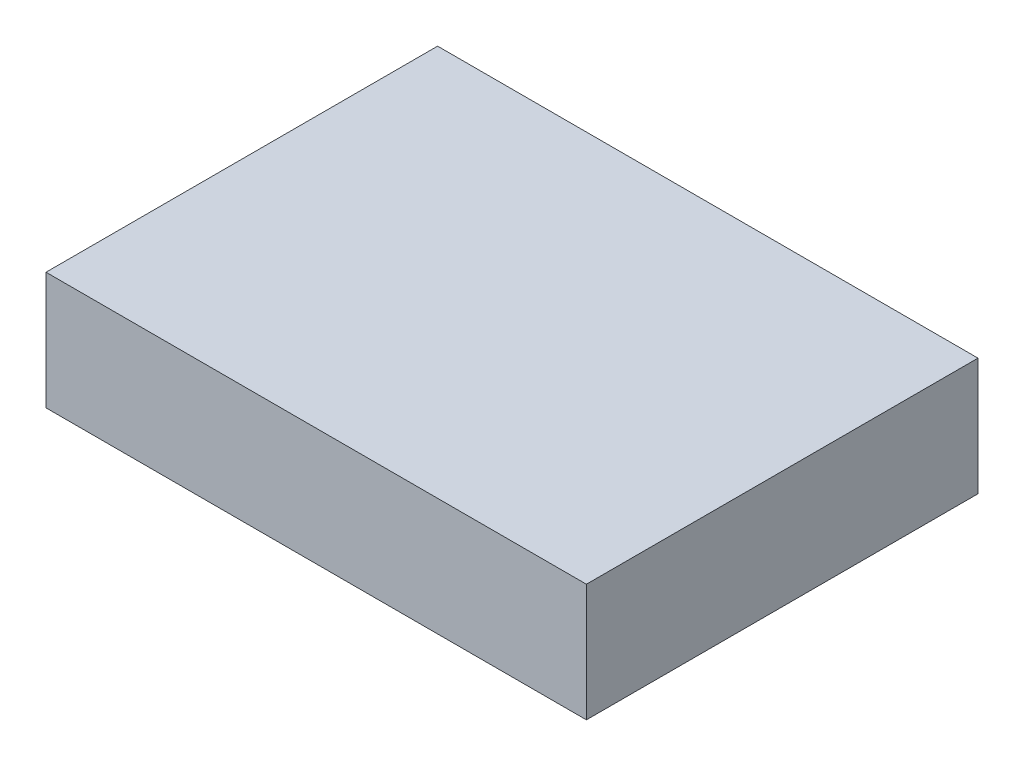
ISO-10303-21;
HEADER;
FILE_DESCRIPTION(('STEP AP214'),'2;1');
FILE_NAME('part.step','',(''),(''),'','','');
FILE_SCHEMA(('AUTOMOTIVE_DESIGN { 1 0 10303 214 1 1 1 1 }'));
ENDSEC;
DATA;
#1=APPLICATION_CONTEXT('core data for automotive mechanical design processes');
#2=APPLICATION_PROTOCOL_DEFINITION('international standard','automotive_design',2000,#1);
#3=PRODUCT_CONTEXT('',#1,'mechanical');
#4=PRODUCT('Part','Part','',(#3));
#5=PRODUCT_RELATED_PRODUCT_CATEGORY('part','',(#4));
#6=PRODUCT_DEFINITION_FORMATION('','',#4);
#7=PRODUCT_DEFINITION_CONTEXT('part definition',#1,'design');
#8=PRODUCT_DEFINITION('design','',#6,#7);
#9=PRODUCT_DEFINITION_SHAPE('','',#8);
#10=(LENGTH_UNIT() NAMED_UNIT(*) SI_UNIT(.MILLI.,.METRE.));
#11=(NAMED_UNIT(*) PLANE_ANGLE_UNIT() SI_UNIT($,.RADIAN.));
#12=(NAMED_UNIT(*) SI_UNIT($,.STERADIAN.) SOLID_ANGLE_UNIT());
#13=UNCERTAINTY_MEASURE_WITH_UNIT(LENGTH_MEASURE(1.E-05),#10,'distance_accuracy_value','');
#14=(GEOMETRIC_REPRESENTATION_CONTEXT(3) GLOBAL_UNCERTAINTY_ASSIGNED_CONTEXT((#13)) GLOBAL_UNIT_ASSIGNED_CONTEXT((#10,
#11,#12)) REPRESENTATION_CONTEXT('',''));
#15=CARTESIAN_POINT('',(0.,0.,0.));
#16=DIRECTION('',(0.,0.,1.));
#17=DIRECTION('',(1.,0.,0.));
#18=AXIS2_PLACEMENT_3D('',#15,#16,#17);
#19=CARTESIAN_POINT('',(34.5,15.,25.));
#20=DIRECTION('',(-1.,0.,0.));
#21=DIRECTION('',(0.,0.,1.));
#22=AXIS2_PLACEMENT_3D('',#19,#20,#21);
#23=PLANE('',#22);
#24=DIRECTION('',(0.,0.,-1.));
#25=VECTOR('',#24,1.);
#26=CARTESIAN_POINT('',(34.5,0.,25.));
#27=LINE('',#26,#25);
#28=CARTESIAN_POINT('',(34.5,0.,25.));
#29=VERTEX_POINT('',#28);
#30=CARTESIAN_POINT('',(34.5,0.,-25.));
#31=VERTEX_POINT('',#30);
#32=EDGE_CURVE('E110',#29,#31,#27,.T.);
#33=ORIENTED_EDGE('',*,*,#32,.T.);
#34=DIRECTION('',(0.,-1.,0.));
#35=VECTOR('',#34,1.);
#36=CARTESIAN_POINT('',(34.5,15.,-25.));
#37=LINE('',#36,#35);
#38=CARTESIAN_POINT('',(34.5,15.,-25.));
#39=VERTEX_POINT('',#38);
#40=EDGE_CURVE('E11',#39,#31,#37,.T.);
#41=ORIENTED_EDGE('',*,*,#40,.F.);
#42=DIRECTION('',(0.,0.,-1.));
#43=VECTOR('',#42,1.);
#44=CARTESIAN_POINT('',(34.5,15.,25.));
#45=LINE('',#44,#43);
#46=CARTESIAN_POINT('',(34.5,15.,25.));
#47=VERTEX_POINT('',#46);
#48=EDGE_CURVE('E92',#47,#39,#45,.T.);
#49=ORIENTED_EDGE('',*,*,#48,.F.);
#50=DIRECTION('',(0.,-1.,0.));
#51=VECTOR('',#50,1.);
#52=CARTESIAN_POINT('',(34.5,15.,25.));
#53=LINE('',#52,#51);
#54=EDGE_CURVE('E103',#47,#29,#53,.T.);
#55=ORIENTED_EDGE('',*,*,#54,.T.);
#56=EDGE_LOOP('',(#33,#41,#49,#55));
#57=FACE_BOUND('',#56,.T.);
#58=ADVANCED_FACE('F42',(#57),#23,.F.);
#59=CARTESIAN_POINT('',(-34.5,15.,-25.));
#60=DIRECTION('',(0.,0.,1.));
#61=DIRECTION('',(1.,0.,0.));
#62=AXIS2_PLACEMENT_3D('',#59,#60,#61);
#63=PLANE('',#62);
#64=DIRECTION('',(-1.,0.,0.));
#65=VECTOR('',#64,1.);
#66=CARTESIAN_POINT('',(-34.5,0.,-25.));
#67=LINE('',#66,#65);
#68=CARTESIAN_POINT('',(-34.5,0.,-25.));
#69=VERTEX_POINT('',#68);
#70=EDGE_CURVE('E97',#31,#69,#67,.T.);
#71=ORIENTED_EDGE('',*,*,#70,.T.);
#72=DIRECTION('',(0.,-1.,0.));
#73=VECTOR('',#72,1.);
#74=CARTESIAN_POINT('',(-34.5,15.,-25.));
#75=LINE('',#74,#73);
#76=CARTESIAN_POINT('',(-34.5,15.,-25.));
#77=VERTEX_POINT('',#76);
#78=EDGE_CURVE('E55',#77,#69,#75,.T.);
#79=ORIENTED_EDGE('',*,*,#78,.F.);
#80=DIRECTION('',(-1.,0.,0.));
#81=VECTOR('',#80,1.);
#82=CARTESIAN_POINT('',(-34.5,15.,-25.));
#83=LINE('',#82,#81);
#84=EDGE_CURVE('E89',#39,#77,#83,.T.);
#85=ORIENTED_EDGE('',*,*,#84,.F.);
#86=ORIENTED_EDGE('',*,*,#40,.T.);
#87=EDGE_LOOP('',(#71,#79,#85,#86));
#88=FACE_BOUND('',#87,.T.);
#89=ADVANCED_FACE('F98',(#88),#63,.F.);
#90=CARTESIAN_POINT('',(-34.5,15.,25.));
#91=DIRECTION('',(1.,0.,0.));
#92=DIRECTION('',(0.,0.,-1.));
#93=AXIS2_PLACEMENT_3D('',#90,#91,#92);
#94=PLANE('',#93);
#95=DIRECTION('',(0.,0.,1.));
#96=VECTOR('',#95,1.);
#97=CARTESIAN_POINT('',(-34.5,0.,25.));
#98=LINE('',#97,#96);
#99=CARTESIAN_POINT('',(-34.5,0.,25.));
#100=VERTEX_POINT('',#99);
#101=EDGE_CURVE('E79',#69,#100,#98,.T.);
#102=ORIENTED_EDGE('',*,*,#101,.T.);
#103=DIRECTION('',(0.,-1.,0.));
#104=VECTOR('',#103,1.);
#105=CARTESIAN_POINT('',(-34.5,15.,25.));
#106=LINE('',#105,#104);
#107=CARTESIAN_POINT('',(-34.5,15.,25.));
#108=VERTEX_POINT('',#107);
#109=EDGE_CURVE('E99',#108,#100,#106,.T.);
#110=ORIENTED_EDGE('',*,*,#109,.F.);
#111=DIRECTION('',(0.,0.,1.));
#112=VECTOR('',#111,1.);
#113=CARTESIAN_POINT('',(-34.5,15.,25.));
#114=LINE('',#113,#112);
#115=EDGE_CURVE('E91',#77,#108,#114,.T.);
#116=ORIENTED_EDGE('',*,*,#115,.F.);
#117=ORIENTED_EDGE('',*,*,#78,.T.);
#118=EDGE_LOOP('',(#102,#110,#116,#117));
#119=FACE_BOUND('',#118,.T.);
#120=ADVANCED_FACE('F101',(#119),#94,.F.);
#121=CARTESIAN_POINT('',(-34.5,15.,25.));
#122=DIRECTION('',(0.,0.,-1.));
#123=DIRECTION('',(-1.,0.,0.));
#124=AXIS2_PLACEMENT_3D('',#121,#122,#123);
#125=PLANE('',#124);
#126=DIRECTION('',(1.,0.,0.));
#127=VECTOR('',#126,1.);
#128=CARTESIAN_POINT('',(-34.5,0.,25.));
#129=LINE('',#128,#127);
#130=EDGE_CURVE('E84',#100,#29,#129,.T.);
#131=ORIENTED_EDGE('',*,*,#130,.T.);
#132=ORIENTED_EDGE('',*,*,#54,.F.);
#133=DIRECTION('',(1.,0.,0.));
#134=VECTOR('',#133,1.);
#135=CARTESIAN_POINT('',(-34.5,15.,25.));
#136=LINE('',#135,#134);
#137=EDGE_CURVE('E58',#108,#47,#136,.T.);
#138=ORIENTED_EDGE('',*,*,#137,.F.);
#139=ORIENTED_EDGE('',*,*,#109,.T.);
#140=EDGE_LOOP('',(#131,#132,#138,#139));
#141=FACE_BOUND('',#140,.T.);
#142=ADVANCED_FACE('F111',(#141),#125,.F.);
#143=CARTESIAN_POINT('',(0.,15.,0.));
#144=DIRECTION('',(0.,-1.,0.));
#145=DIRECTION('',(0.,0.,-1.));
#146=AXIS2_PLACEMENT_3D('',#143,#144,#145);
#147=PLANE('',#146);
#148=ORIENTED_EDGE('',*,*,#48,.T.);
#149=ORIENTED_EDGE('',*,*,#84,.T.);
#150=ORIENTED_EDGE('',*,*,#115,.T.);
#151=ORIENTED_EDGE('',*,*,#137,.T.);
#152=EDGE_LOOP('',(#148,#149,#150,#151));
#153=FACE_BOUND('',#152,.T.);
#154=ADVANCED_FACE('F93',(#153),#147,.F.);
#155=CARTESIAN_POINT('',(0.,0.,0.));
#156=DIRECTION('',(0.,-1.,0.));
#157=DIRECTION('',(0.,0.,-1.));
#158=AXIS2_PLACEMENT_3D('',#155,#156,#157);
#159=PLANE('',#158);
#160=ORIENTED_EDGE('',*,*,#32,.F.);
#161=ORIENTED_EDGE('',*,*,#130,.F.);
#162=ORIENTED_EDGE('',*,*,#101,.F.);
#163=ORIENTED_EDGE('',*,*,#70,.F.);
#164=EDGE_LOOP('',(#160,#161,#162,#163));
#165=FACE_BOUND('',#164,.T.);
#166=ADVANCED_FACE('F119',(#165),#159,.T.);
#167=CLOSED_SHELL('',(#58,#89,#120,#142,#154,#166));
#168=MANIFOLD_SOLID_BREP('B2',#167);
#169=ADVANCED_BREP_SHAPE_REPRESENTATION('',(#18,#168),#14);
#170=SHAPE_DEFINITION_REPRESENTATION(#9,#169);
ENDSEC;
END-ISO-10303-21;
